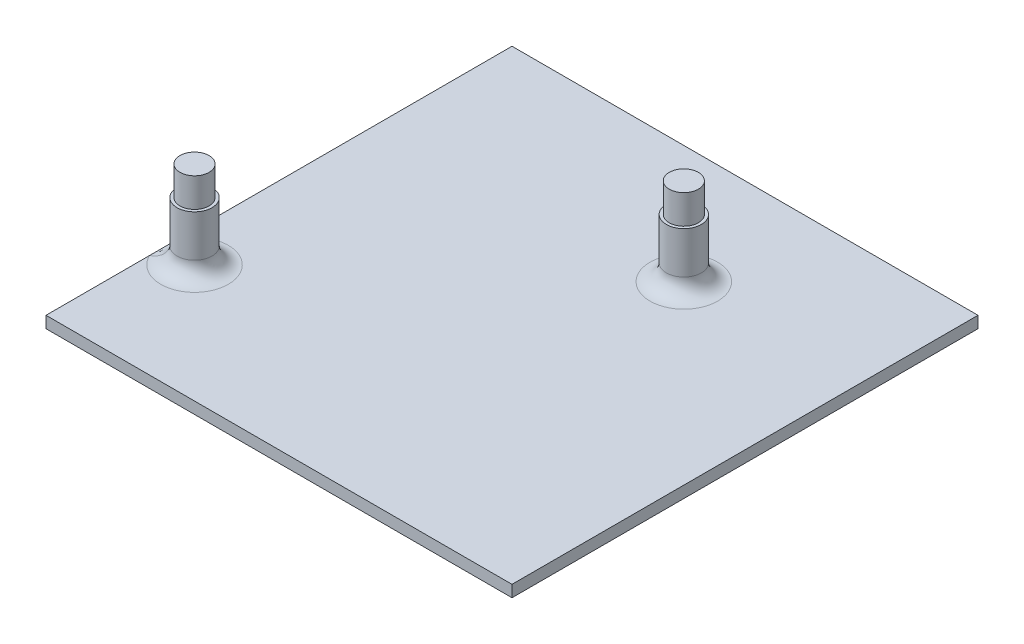
ISO-10303-21;
HEADER;
FILE_DESCRIPTION(('STEP AP214'),'2;1');
FILE_NAME('part.step','',(''),(''),'','','');
FILE_SCHEMA(('AUTOMOTIVE_DESIGN { 1 0 10303 214 1 1 1 1 }'));
ENDSEC;
DATA;
#1=APPLICATION_CONTEXT('core data for automotive mechanical design processes');
#2=APPLICATION_PROTOCOL_DEFINITION('international standard','automotive_design',2000,#1);
#3=PRODUCT_CONTEXT('',#1,'mechanical');
#4=PRODUCT('Part','Part','',(#3));
#5=PRODUCT_RELATED_PRODUCT_CATEGORY('part','',(#4));
#6=PRODUCT_DEFINITION_FORMATION('','',#4);
#7=PRODUCT_DEFINITION_CONTEXT('part definition',#1,'design');
#8=PRODUCT_DEFINITION('design','',#6,#7);
#9=PRODUCT_DEFINITION_SHAPE('','',#8);
#10=(LENGTH_UNIT() NAMED_UNIT(*) SI_UNIT(.MILLI.,.METRE.));
#11=(NAMED_UNIT(*) PLANE_ANGLE_UNIT() SI_UNIT($,.RADIAN.));
#12=(NAMED_UNIT(*) SI_UNIT($,.STERADIAN.) SOLID_ANGLE_UNIT());
#13=UNCERTAINTY_MEASURE_WITH_UNIT(LENGTH_MEASURE(1.E-05),#10,'distance_accuracy_value','');
#14=(GEOMETRIC_REPRESENTATION_CONTEXT(3) GLOBAL_UNCERTAINTY_ASSIGNED_CONTEXT((#13)) GLOBAL_UNIT_ASSIGNED_CONTEXT((#10,
#11,#12)) REPRESENTATION_CONTEXT('',''));
#15=CARTESIAN_POINT('',(0.,0.,0.));
#16=DIRECTION('',(0.,0.,1.));
#17=DIRECTION('',(1.,0.,0.));
#18=AXIS2_PLACEMENT_3D('',#15,#16,#17);
#19=CARTESIAN_POINT('',(22.25,12.,-19.75));
#20=DIRECTION('',(0.,1.,0.));
#21=DIRECTION('',(0.,0.,1.));
#22=AXIS2_PLACEMENT_3D('',#19,#20,#21);
#23=PLANE('',#22);
#24=CARTESIAN_POINT('',(22.25,12.,-19.75));
#25=DIRECTION('',(0.,1.,0.));
#26=DIRECTION('',(0.,0.,1.));
#27=AXIS2_PLACEMENT_3D('',#24,#25,#26);
#28=CIRCLE('',#27,2.99999999999999);
#29=CARTESIAN_POINT('',(22.25,12.,-16.75));
#30=VERTEX_POINT('',#29);
#31=EDGE_CURVE('E184',#30,#30,#28,.T.);
#32=ORIENTED_EDGE('',*,*,#31,.T.);
#33=EDGE_LOOP('',(#32));
#34=FACE_BOUND('',#33,.T.);
#35=CARTESIAN_POINT('',(22.25,12.,-19.75));
#36=DIRECTION('',(0.,1.,0.));
#37=DIRECTION('',(0.,0.,1.));
#38=AXIS2_PLACEMENT_3D('',#35,#36,#37);
#39=CIRCLE('',#38,2.5);
#40=CARTESIAN_POINT('',(22.25,12.,-17.25));
#41=VERTEX_POINT('',#40);
#42=EDGE_CURVE('E198',#41,#41,#39,.T.);
#43=ORIENTED_EDGE('',*,*,#42,.F.);
#44=EDGE_LOOP('',(#43));
#45=FACE_BOUND('',#44,.T.);
#46=ADVANCED_FACE('F37',(#34,#45),#23,.T.);
#47=CARTESIAN_POINT('',(-22.25,12.,19.75));
#48=DIRECTION('',(0.,1.,0.));
#49=DIRECTION('',(0.,0.,1.));
#50=AXIS2_PLACEMENT_3D('',#47,#48,#49);
#51=PLANE('',#50);
#52=CARTESIAN_POINT('',(-22.25,12.,19.75));
#53=DIRECTION('',(0.,1.,0.));
#54=DIRECTION('',(0.,0.,1.));
#55=AXIS2_PLACEMENT_3D('',#52,#53,#54);
#56=CIRCLE('',#55,2.99999999999999);
#57=CARTESIAN_POINT('',(-22.25,12.,22.75));
#58=VERTEX_POINT('',#57);
#59=EDGE_CURVE('E134',#58,#58,#56,.T.);
#60=ORIENTED_EDGE('',*,*,#59,.T.);
#61=EDGE_LOOP('',(#60));
#62=FACE_BOUND('',#61,.T.);
#63=CARTESIAN_POINT('',(-22.25,12.,19.75));
#64=DIRECTION('',(0.,1.,0.));
#65=DIRECTION('',(0.,0.,1.));
#66=AXIS2_PLACEMENT_3D('',#63,#64,#65);
#67=CIRCLE('',#66,2.5);
#68=CARTESIAN_POINT('',(-22.25,12.,22.25));
#69=VERTEX_POINT('',#68);
#70=EDGE_CURVE('E190',#69,#69,#67,.T.);
#71=ORIENTED_EDGE('',*,*,#70,.F.);
#72=EDGE_LOOP('',(#71));
#73=FACE_BOUND('',#72,.T.);
#74=ADVANCED_FACE('F203',(#62,#73),#51,.T.);
#75=CARTESIAN_POINT('',(0.,2.,0.));
#76=DIRECTION('',(0.,1.,0.));
#77=DIRECTION('',(0.,0.,1.));
#78=AXIS2_PLACEMENT_3D('',#75,#76,#77);
#79=PLANE('',#78);
#80=CARTESIAN_POINT('',(22.25,2.,-19.75));
#81=DIRECTION('',(0.,1.,0.));
#82=DIRECTION('',(0.,0.,1.));
#83=AXIS2_PLACEMENT_3D('',#80,#81,#82);
#84=CIRCLE('',#83,5.79999999999999);
#85=CARTESIAN_POINT('',(22.25,2.,-13.95));
#86=VERTEX_POINT('',#85);
#87=EDGE_CURVE('E149',#86,#86,#84,.F.);
#88=ORIENTED_EDGE('',*,*,#87,.T.);
#89=EDGE_LOOP('',(#88));
#90=FACE_BOUND('',#89,.T.);
#91=DIRECTION('',(0.,0.,-1.));
#92=VECTOR('',#91,1.);
#93=CARTESIAN_POINT('',(-27.5,2.,0.));
#94=LINE('',#93,#92);
#95=CARTESIAN_POINT('',(-27.5,2.,17.2847413928759));
#96=VERTEX_POINT('',#95);
#97=CARTESIAN_POINT('',(-27.5,2.,-40.));
#98=VERTEX_POINT('',#97);
#99=EDGE_CURVE('E122',#96,#98,#94,.T.);
#100=ORIENTED_EDGE('',*,*,#99,.F.);
#101=CARTESIAN_POINT('',(-22.25,2.,19.75));
#102=DIRECTION('',(0.,1.,0.));
#103=DIRECTION('',(0.,0.,1.));
#104=AXIS2_PLACEMENT_3D('',#101,#102,#103);
#105=CIRCLE('',#104,5.79999999999999);
#106=CARTESIAN_POINT('',(-27.5,2.,22.2152586071241));
#107=VERTEX_POINT('',#106);
#108=EDGE_CURVE('E147',#96,#107,#105,.F.);
#109=ORIENTED_EDGE('',*,*,#108,.T.);
#110=CARTESIAN_POINT('',(-27.5,2.,40.));
#111=VERTEX_POINT('',#110);
#112=EDGE_CURVE('E126',#111,#107,#94,.T.);
#113=ORIENTED_EDGE('',*,*,#112,.F.);
#114=DIRECTION('',(1.,0.,0.));
#115=VECTOR('',#114,1.);
#116=CARTESIAN_POINT('',(0.,2.,40.));
#117=LINE('',#116,#115);
#118=CARTESIAN_POINT('',(52.5,2.,40.));
#119=VERTEX_POINT('',#118);
#120=EDGE_CURVE('E116',#111,#119,#117,.T.);
#121=ORIENTED_EDGE('',*,*,#120,.T.);
#122=DIRECTION('',(0.,0.,1.));
#123=VECTOR('',#122,1.);
#124=CARTESIAN_POINT('',(52.5,2.,0.));
#125=LINE('',#124,#123);
#126=CARTESIAN_POINT('',(52.5,2.,-40.));
#127=VERTEX_POINT('',#126);
#128=EDGE_CURVE('E99',#127,#119,#125,.T.);
#129=ORIENTED_EDGE('',*,*,#128,.F.);
#130=DIRECTION('',(1.,0.,0.));
#131=VECTOR('',#130,1.);
#132=CARTESIAN_POINT('',(0.,2.,-40.));
#133=LINE('',#132,#131);
#134=EDGE_CURVE('E113',#98,#127,#133,.T.);
#135=ORIENTED_EDGE('',*,*,#134,.F.);
#136=EDGE_LOOP('',(#100,#109,#113,#121,#129,#135));
#137=FACE_BOUND('',#136,.T.);
#138=ADVANCED_FACE('F112',(#90,#137),#79,.T.);
#139=CARTESIAN_POINT('',(52.5,2.,0.));
#140=DIRECTION('',(1.,0.,0.));
#141=DIRECTION('',(0.,0.,-1.));
#142=AXIS2_PLACEMENT_3D('',#139,#140,#141);
#143=PLANE('',#142);
#144=DIRECTION('',(0.,0.,1.));
#145=VECTOR('',#144,1.);
#146=CARTESIAN_POINT('',(52.5,0.,0.));
#147=LINE('',#146,#145);
#148=CARTESIAN_POINT('',(52.5,0.,-40.));
#149=VERTEX_POINT('',#148);
#150=CARTESIAN_POINT('',(52.5,0.,40.));
#151=VERTEX_POINT('',#150);
#152=EDGE_CURVE('E101',#149,#151,#147,.T.);
#153=ORIENTED_EDGE('',*,*,#152,.F.);
#154=DIRECTION('',(0.,-1.,0.));
#155=VECTOR('',#154,1.);
#156=CARTESIAN_POINT('',(52.5,2.,-40.));
#157=LINE('',#156,#155);
#158=EDGE_CURVE('E96',#127,#149,#157,.T.);
#159=ORIENTED_EDGE('',*,*,#158,.F.);
#160=ORIENTED_EDGE('',*,*,#128,.T.);
#161=DIRECTION('',(0.,-1.,0.));
#162=VECTOR('',#161,1.);
#163=CARTESIAN_POINT('',(52.5,2.,40.));
#164=LINE('',#163,#162);
#165=EDGE_CURVE('E131',#119,#151,#164,.T.);
#166=ORIENTED_EDGE('',*,*,#165,.T.);
#167=EDGE_LOOP('',(#153,#159,#160,#166));
#168=FACE_BOUND('',#167,.T.);
#169=ADVANCED_FACE('F98',(#168),#143,.T.);
#170=CARTESIAN_POINT('',(0.,2.,-40.));
#171=DIRECTION('',(0.,0.,-1.));
#172=DIRECTION('',(-1.,0.,0.));
#173=AXIS2_PLACEMENT_3D('',#170,#171,#172);
#174=PLANE('',#173);
#175=DIRECTION('',(1.,0.,0.));
#176=VECTOR('',#175,1.);
#177=CARTESIAN_POINT('',(0.,0.,-40.));
#178=LINE('',#177,#176);
#179=CARTESIAN_POINT('',(-27.5,0.,-40.));
#180=VERTEX_POINT('',#179);
#181=EDGE_CURVE('E133',#180,#149,#178,.T.);
#182=ORIENTED_EDGE('',*,*,#181,.F.);
#183=DIRECTION('',(0.,-1.,0.));
#184=VECTOR('',#183,1.);
#185=CARTESIAN_POINT('',(-27.5,2.,-40.));
#186=LINE('',#185,#184);
#187=EDGE_CURVE('E107',#98,#180,#186,.T.);
#188=ORIENTED_EDGE('',*,*,#187,.F.);
#189=ORIENTED_EDGE('',*,*,#134,.T.);
#190=ORIENTED_EDGE('',*,*,#158,.T.);
#191=EDGE_LOOP('',(#182,#188,#189,#190));
#192=FACE_BOUND('',#191,.T.);
#193=ADVANCED_FACE('F121',(#192),#174,.T.);
#194=CARTESIAN_POINT('',(-27.5,2.,0.));
#195=DIRECTION('',(-1.,0.,0.));
#196=DIRECTION('',(0.,0.,1.));
#197=AXIS2_PLACEMENT_3D('',#194,#195,#196);
#198=PLANE('',#197);
#199=DIRECTION('',(0.,0.,-1.));
#200=VECTOR('',#199,1.);
#201=CARTESIAN_POINT('',(-27.5,0.,0.));
#202=LINE('',#201,#200);
#203=CARTESIAN_POINT('',(-27.5,0.,40.));
#204=VERTEX_POINT('',#203);
#205=EDGE_CURVE('E136',#204,#180,#202,.T.);
#206=ORIENTED_EDGE('',*,*,#205,.F.);
#207=DIRECTION('',(0.,-1.,0.));
#208=VECTOR('',#207,1.);
#209=CARTESIAN_POINT('',(-27.5,2.,40.));
#210=LINE('',#209,#208);
#211=EDGE_CURVE('E142',#111,#204,#210,.T.);
#212=ORIENTED_EDGE('',*,*,#211,.F.);
#213=ORIENTED_EDGE('',*,*,#112,.T.);
#214=EDGE_CURVE('E124',#107,#96,#94,.T.);
#215=ORIENTED_EDGE('',*,*,#214,.T.);
#216=ORIENTED_EDGE('',*,*,#99,.T.);
#217=ORIENTED_EDGE('',*,*,#187,.T.);
#218=EDGE_LOOP('',(#206,#212,#213,#215,#216,#217));
#219=FACE_BOUND('',#218,.T.);
#220=ADVANCED_FACE('F179',(#219),#198,.T.);
#221=CARTESIAN_POINT('',(0.,2.,40.));
#222=DIRECTION('',(0.,0.,-1.));
#223=DIRECTION('',(-1.,0.,0.));
#224=AXIS2_PLACEMENT_3D('',#221,#222,#223);
#225=PLANE('',#224);
#226=DIRECTION('',(1.,0.,0.));
#227=VECTOR('',#226,1.);
#228=CARTESIAN_POINT('',(0.,0.,40.));
#229=LINE('',#228,#227);
#230=EDGE_CURVE('E118',#204,#151,#229,.T.);
#231=ORIENTED_EDGE('',*,*,#230,.T.);
#232=ORIENTED_EDGE('',*,*,#165,.F.);
#233=ORIENTED_EDGE('',*,*,#120,.F.);
#234=ORIENTED_EDGE('',*,*,#211,.T.);
#235=EDGE_LOOP('',(#231,#232,#233,#234));
#236=FACE_BOUND('',#235,.T.);
#237=ADVANCED_FACE('F215',(#236),#225,.F.);
#238=CARTESIAN_POINT('',(0.,0.,0.));
#239=DIRECTION('',(0.,1.,0.));
#240=DIRECTION('',(0.,0.,1.));
#241=AXIS2_PLACEMENT_3D('',#238,#239,#240);
#242=PLANE('',#241);
#243=ORIENTED_EDGE('',*,*,#152,.T.);
#244=ORIENTED_EDGE('',*,*,#230,.F.);
#245=ORIENTED_EDGE('',*,*,#205,.T.);
#246=ORIENTED_EDGE('',*,*,#181,.T.);
#247=EDGE_LOOP('',(#243,#244,#245,#246));
#248=FACE_BOUND('',#247,.T.);
#249=ADVANCED_FACE('F208',(#248),#242,.F.);
#250=CARTESIAN_POINT('',(-22.25,12.,19.75));
#251=DIRECTION('',(0.,-1.,0.));
#252=DIRECTION('',(0.,0.,-1.));
#253=AXIS2_PLACEMENT_3D('',#250,#251,#252);
#254=CYLINDRICAL_SURFACE('',#253,2.99999999999999);
#255=CARTESIAN_POINT('',(-22.25,4.8,19.75));
#256=DIRECTION('',(0.,1.,0.));
#257=DIRECTION('',(0.,0.,1.));
#258=AXIS2_PLACEMENT_3D('',#255,#256,#257);
#259=CIRCLE('',#258,2.99999999999999);
#260=CARTESIAN_POINT('',(-24.9655172413793,4.8,21.0251337623056));
#261=VERTEX_POINT('',#260);
#262=CARTESIAN_POINT('',(-24.9655172413793,4.8,18.4748662376944));
#263=VERTEX_POINT('',#262);
#264=EDGE_CURVE('E50',#261,#263,#259,.T.);
#265=ORIENTED_EDGE('',*,*,#264,.T.);
#266=CARTESIAN_POINT('',(-24.7692528942936,4.77417049656208,18.1210847613846));
#267=CARTESIAN_POINT('',(-24.8954852423719,1.64376070176841,18.3163135865014));
#268=CARTESIAN_POINT('',(-27.5,2.,16.6007638720103));
#269=CARTESIAN_POINT('',(-24.8110918119802,4.78517692842336,18.185767646076));
#270=CARTESIAN_POINT('',(-24.8972590270731,1.72067115016347,18.3295160766704));
#271=CARTESIAN_POINT('',(-27.5,2.,16.725817449076));
#272=CARTESIAN_POINT('',(-24.850472839914,4.79204629072668,18.252161558553));
#273=CARTESIAN_POINT('',(-24.9076179563057,1.79329308559051,18.353310456867));
#274=CARTESIAN_POINT('',(-27.5,2.,16.8541790131978));
#275=CARTESIAN_POINT('',(-24.9240101398747,4.79976853239917,18.3877983466798));
#276=CARTESIAN_POINT('',(-24.9387131702983,1.92626409147773,18.4190561636837));
#277=CARTESIAN_POINT('',(-27.5,2.,17.1164101369115));
#278=CARTESIAN_POINT('',(-24.958171394117,4.80062718445945,18.4570384245507));
#279=CARTESIAN_POINT('',(-24.9592390350264,1.98702493845238,18.4606502081707));
#280=CARTESIAN_POINT('',(-27.5,2.,17.250274287464));
#281=CARTESIAN_POINT('',(-25.0210265718221,4.7985986028877,18.5978870073453));
#282=CARTESIAN_POINT('',(-25.0042832348371,2.09565548832035,18.559171195585));
#283=CARTESIAN_POINT('',(-27.5,2.,17.522581547535));
#284=CARTESIAN_POINT('',(-25.0497230997607,4.79571315883266,18.669494364835));
#285=CARTESIAN_POINT('',(-25.0287811240282,2.1439214416585,18.6159228247551));
#286=CARTESIAN_POINT('',(-27.5,2.,17.6610224386807));
#287=CARTESIAN_POINT('',(-25.101517477056,4.78808057493382,18.8146981189408));
#288=CARTESIAN_POINT('',(-25.0772207182193,2.22849678613192,18.7415277936623));
#289=CARTESIAN_POINT('',(-27.5,2.,17.9417496966184));
#290=CARTESIAN_POINT('',(-25.1246138929492,4.78333295924137,18.8882950194743));
#291=CARTESIAN_POINT('',(-25.1012448452894,2.26512399463445,18.8103804447597));
#292=CARTESIAN_POINT('',(-27.5,2.,18.0840370376502));
#293=CARTESIAN_POINT('',(-25.1655895314774,4.77344839757793,19.0389531785771));
#294=CARTESIAN_POINT('',(-25.1460559294076,2.32834314771791,18.9590241895285));
#295=CARTESIAN_POINT('',(-27.5,2.,18.3753094785825));
#296=CARTESIAN_POINT('',(-25.1833197156384,4.76830458835179,19.116054875812));
#297=CARTESIAN_POINT('',(-25.1668811404398,2.35492044597049,19.0392141681105));
#298=CARTESIAN_POINT('',(-27.5,2.,18.5243727599032));
#299=CARTESIAN_POINT('',(-25.2126381723922,4.75908767556742,19.2714341882516));
#300=CARTESIAN_POINT('',(-25.2022205209154,2.39791976692792,19.2060401722496));
#301=CARTESIAN_POINT('',(-27.5,2.,18.8247727639529));
#302=CARTESIAN_POINT('',(-25.2242265270297,4.75501455770689,19.3497117877337));
#303=CARTESIAN_POINT('',(-25.2168587071532,2.41451548263067,19.29292805439));
#304=CARTESIAN_POINT('',(-27.5,2.,18.9761094562852));
#305=CARTESIAN_POINT('',(-25.2411816618021,4.74886206719833,19.5069336120456));
#306=CARTESIAN_POINT('',(-25.2384544756664,2.43848419453875,19.4701745419312));
#307=CARTESIAN_POINT('',(-27.5,2.,19.2800716499548));
#308=CARTESIAN_POINT('',(-25.2465505700511,4.74678201262405,19.5858775995377));
#309=CARTESIAN_POINT('',(-25.2454974468607,2.44595592350541,19.5608566125283));
#310=CARTESIAN_POINT('',(-27.5,2.,19.4326966924396));
#311=CARTESIAN_POINT('',(-25.2510357833348,4.74505231404402,19.743952092535));
#312=CARTESIAN_POINT('',(-25.2513477811699,2.45218261121962,19.7428695359571));
#313=CARTESIAN_POINT('',(-27.5,2.,19.738307378901));
#314=CARTESIAN_POINT('',(-25.2501518889402,4.74540274755724,19.8230826039088));
#315=CARTESIAN_POINT('',(-25.2501781075379,2.45096194310976,19.8345591480407));
#316=CARTESIAN_POINT('',(-27.5,2.,19.8912930342236));
#317=CARTESIAN_POINT('',(-25.2419097670635,4.74855114933611,19.9854900925861));
#318=CARTESIAN_POINT('',(-25.2394661562374,2.43948446257397,20.020935905976));
#319=CARTESIAN_POINT('',(-27.5,2.,20.2052808456665));
#320=CARTESIAN_POINT('',(-25.2341876719489,4.7514866206219,20.0687480702024));
#321=CARTESIAN_POINT('',(-25.2294064532954,2.42866925559245,20.1158900982203));
#322=CARTESIAN_POINT('',(-27.5,2.,20.3662462690581));
#323=CARTESIAN_POINT('',(-25.2118276987181,4.75929567146594,20.234309344898));
#324=CARTESIAN_POINT('',(-25.201345871515,2.39672316592056,20.3000950359052));
#325=CARTESIAN_POINT('',(-27.5,2.,20.6863314001361));
#326=CARTESIAN_POINT('',(-25.1971892463749,4.76416941194268,20.3166125621273));
#327=CARTESIAN_POINT('',(-25.1832268220365,2.37544855793896,20.3897045494446));
#328=CARTESIAN_POINT('',(-27.5,2.,20.845450953446));
#329=CARTESIAN_POINT('',(-25.161103533737,4.77457322202537,20.47969207122));
#330=CARTESIAN_POINT('',(-25.141122331435,2.32152161571593,20.5598843313358));
#331=CARTESIAN_POINT('',(-27.5,2.,21.1607380043588));
#332=CARTESIAN_POINT('',(-25.1396568298362,4.7801032379751,20.5604684872876));
#333=CARTESIAN_POINT('',(-25.1169818334237,2.28862637223174,20.6407057313229));
#334=CARTESIAN_POINT('',(-27.5,2.,21.3169057420896));
#335=CARTESIAN_POINT('',(-25.0900948968472,4.79003775233187,20.719965490956));
#336=CARTESIAN_POINT('',(-25.0660777594657,2.21014529847881,20.7898771822572));
#337=CARTESIAN_POINT('',(-27.5,2.,21.6252666158484));
#338=CARTESIAN_POINT('',(-25.0619803871397,4.79444237205001,20.7986862993174));
#339=CARTESIAN_POINT('',(-25.0391738093877,2.16420640113049,20.8583200189413));
#340=CARTESIAN_POINT('',(-27.5,2.,21.7774601786799));
#341=CARTESIAN_POINT('',(-25.0046578876957,4.79942741935019,20.9402295163838));
#342=CARTESIAN_POINT('',(-24.9920330498828,2.06777707786534,20.9686045214795));
#343=CARTESIAN_POINT('',(-27.5,2.,22.0511103983424));
#344=CARTESIAN_POINT('',(-24.9764671763034,4.80053475633949,21.0034602088649));
#345=CARTESIAN_POINT('',(-24.9713501667145,2.01900312146797,21.0130801128218));
#346=CARTESIAN_POINT('',(-27.5,2.,22.1733564038066));
#347=CARTESIAN_POINT('',(-24.9157991347862,4.79896363535338,21.1277874097319));
#348=CARTESIAN_POINT('',(-24.9351640174477,1.91180905272332,21.0889856028493));
#349=CARTESIAN_POINT('',(-27.5,2.,22.4137223254806));
#350=CARTESIAN_POINT('',(-24.8833239809261,4.79628709272234,21.1888849818343));
#351=CARTESIAN_POINT('',(-24.9197218564199,1.85310104467818,21.1202464060257));
#352=CARTESIAN_POINT('',(-27.5,2.,22.5318442982087));
#353=CARTESIAN_POINT('',(-24.8142134403087,4.78548799501285,21.3087148471261));
#354=CARTESIAN_POINT('',(-24.8987281718112,1.72651431990266,21.1678216577369));
#355=CARTESIAN_POINT('',(-27.5,2.,22.7635153711148));
#356=CARTESIAN_POINT('',(-24.7775706571264,4.77735562800164,21.3674426764004));
#357=CARTESIAN_POINT('',(-24.8933952490675,1.65833151353528,21.1838167695508));
#358=CARTESIAN_POINT('',(-27.5,2.,22.877055841057));
#359=CARTESIAN_POINT('',(-24.7004720897557,4.75373849685538,21.4820484057565));
#360=CARTESIAN_POINT('',(-24.8983284917734,1.51534107440832,21.1997472047897));
#361=CARTESIAN_POINT('',(-27.5,2.,23.098626917822));
#362=CARTESIAN_POINT('',(-24.6600104266803,4.73824224358762,21.5379217008061));
#363=CARTESIAN_POINT('',(-24.9089901150295,1.4403216544844,21.1992819280106));
#364=CARTESIAN_POINT('',(-27.5,2.,23.2066486215823));
#365=CARTESIAN_POINT('',(-24.6178474110053,4.71812411170249,21.5920908333183));
#366=CARTESIAN_POINT('',(-24.9305172770385,1.36459567981096,21.1901809386512));
#367=CARTESIAN_POINT('',(-27.5,2.,23.3113756110821));
#368=(BOUNDED_SURFACE() B_SPLINE_SURFACE(3,2,((#266,#267,#268),(#269,#270,#271),(#272,#273,
#274),(#275,#276,#277),(#278,#279,#280),(#281,#282,#283),(#284,#285,#286),(#287,#288,#289),
(#290,#291,#292),(#293,#294,#295),(#296,#297,#298),(#299,#300,#301),(#302,#303,#304),(#305,#306,
#307),(#308,#309,#310),(#311,#312,#313),(#314,#315,#316),(#317,#318,#319),(#320,#321,#322),
(#323,#324,#325),(#326,#327,#328),(#329,#330,#331),(#332,#333,#334),(#335,#336,#337),(#338,#339,
#340),(#341,#342,#343),(#344,#345,#346),(#347,#348,#349),(#350,#351,#352),(#353,#354,#355),
(#356,#357,#358),(#359,#360,#361),(#362,#363,#364),(#365,#366,#367)),.UNSPECIFIED.,.F.,.F.,
.F.) B_SPLINE_SURFACE_WITH_KNOTS((4,2,2,2,2,2,2,2,2,2,2,2,2,2,2,2,4),(3,3),(0.,
0.447699936927959,0.894969843401298,1.34202604564867,1.78919656057607,2.24783852294819,
2.70647435846911,3.16495321572425,3.62344669595603,4.10790903247478,4.59241159830107,
5.07687457909074,5.56128531556369,5.96249176829797,6.36349520890832,6.76522176739417,
7.16757716771426),(0.,1.),
.UNSPECIFIED.) GEOMETRIC_REPRESENTATION_ITEM() RATIONAL_B_SPLINE_SURFACE(((1.,0.665657729961146,
1.),(1.,0.674068192248949,1.),(1.,0.682261572337793,1.),(1.,0.697947007885751,1.),(1.,
0.705439729430743,1.),(1.,0.719470488128708,1.),(1.,0.726008979716519,1.),(1.,0.737961337738242,
1.),(1.,0.743374916176966,1.),(1.,0.753062881688334,1.),(1.,0.75730448195919,1.),(1.,
0.764356441895352,1.),(1.,0.767166820679387,1.),(1.,0.771288600852572,1.),(1.,0.772600514970675,
1.),(1.,0.773696096727978,1.),(1.,0.773479715623109,1.),(1.,0.771467977598784,1.),(1.,
0.769583882386171,1.),(1.,0.7641640480684,1.),(1.,0.760628171825242,1.),(1.,0.752000048847341,
1.),(1.,0.74690792929545,1.),(1.,0.735309004362114,1.),(1.,0.728802351599106,1.),(1.,
0.715796759392189,1.),(1.,0.70948845982624,1.),(1.,0.696193884665162,1.),(1.,0.689207953743885,
1.),(1.,0.674734333407205,1.),(1.,0.667245761902015,1.),(1.,0.652032309829969,1.),(1.,
0.644307077706566,1.),(1.,0.636602950799728,1.))) REPRESENTATION_ITEM('') SURFACE());
#369=CARTESIAN_POINT('',(-24.7692528942936,4.77417049656208,18.1210847613846));
#370=CARTESIAN_POINT('',(-24.8110918119802,4.78517692842336,18.185767646076));
#371=CARTESIAN_POINT('',(-24.850472839914,4.79204629072668,18.252161558553));
#372=CARTESIAN_POINT('',(-24.9240101398747,4.79976853239917,18.3877983466798));
#373=CARTESIAN_POINT('',(-24.958171394117,4.80062718445945,18.4570384245507));
#374=CARTESIAN_POINT('',(-25.0210265718221,4.7985986028877,18.5978870073453));
#375=CARTESIAN_POINT('',(-25.0497230997607,4.79571315883266,18.669494364835));
#376=CARTESIAN_POINT('',(-25.101517477056,4.78808057493382,18.8146981189408));
#377=CARTESIAN_POINT('',(-25.1246138929492,4.78333295924137,18.8882950194743));
#378=CARTESIAN_POINT('',(-25.1655895314774,4.77344839757793,19.0389531785771));
#379=CARTESIAN_POINT('',(-25.1833197156384,4.76830458835179,19.116054875812));
#380=CARTESIAN_POINT('',(-25.2126381723922,4.75908767556742,19.2714341882516));
#381=CARTESIAN_POINT('',(-25.2242265270297,4.75501455770689,19.3497117877337));
#382=CARTESIAN_POINT('',(-25.2411816618021,4.74886206719833,19.5069336120456));
#383=CARTESIAN_POINT('',(-25.2465505700511,4.74678201262405,19.5858775995377));
#384=CARTESIAN_POINT('',(-25.2510357833348,4.74505231404402,19.743952092535));
#385=CARTESIAN_POINT('',(-25.2501518889402,4.74540274755724,19.8230826039088));
#386=CARTESIAN_POINT('',(-25.2419097670635,4.74855114933611,19.9854900925861));
#387=CARTESIAN_POINT('',(-25.2341876719489,4.7514866206219,20.0687480702024));
#388=CARTESIAN_POINT('',(-25.2118276987181,4.75929567146594,20.234309344898));
#389=CARTESIAN_POINT('',(-25.1971892463749,4.76416941194268,20.3166125621273));
#390=CARTESIAN_POINT('',(-25.161103533737,4.77457322202537,20.47969207122));
#391=CARTESIAN_POINT('',(-25.1396568298362,4.7801032379751,20.5604684872876));
#392=CARTESIAN_POINT('',(-25.0900948968472,4.79003775233187,20.719965490956));
#393=CARTESIAN_POINT('',(-25.0619803871397,4.79444237205001,20.7986862993174));
#394=CARTESIAN_POINT('',(-25.0046578876957,4.79942741935019,20.9402295163838));
#395=CARTESIAN_POINT('',(-24.9764671763034,4.80053475633949,21.0034602088649));
#396=CARTESIAN_POINT('',(-24.9157991347862,4.79896363535338,21.1277874097319));
#397=CARTESIAN_POINT('',(-24.8833239809261,4.79628709272234,21.1888849818343));
#398=CARTESIAN_POINT('',(-24.8142134403087,4.78548799501285,21.3087148471261));
#399=CARTESIAN_POINT('',(-24.7775706571264,4.77735562800164,21.3674426764004));
#400=CARTESIAN_POINT('',(-24.7004720897557,4.75373849685538,21.4820484057565));
#401=CARTESIAN_POINT('',(-24.6600104266803,4.73824224358762,21.5379217008061));
#402=CARTESIAN_POINT('',(-24.6178474110053,4.71812411170249,21.5920908333183));
#403=B_SPLINE_CURVE_WITH_KNOTS('',3,(#369,#370,#371,#372,#373,#374,#375,#376,#377,#378,#379,
#380,#381,#382,#383,#384,#385,#386,#387,#388,#389,#390,#391,#392,#393,#394,#395,#396,#397,#398,
#399,#400,#401,#402),.UNSPECIFIED.,.F.,.F.,(4,2,2,2,2,2,2,2,2,2,2,2,2,2,2,2,4),(0.,
0.447699936927959,0.894969843401298,1.34202604564867,1.78919656057607,2.24783852294819,
2.70647435846911,3.16495321572425,3.62344669595603,4.10790903247478,4.59241159830107,
5.07687457909074,5.56128531556369,5.96249176829797,6.36349520890832,6.76522176739417,
7.16757716771426),.UNSPECIFIED.);
#404=EDGE_CURVE('E11',#263,#261,#403,.T.);
#405=ORIENTED_EDGE('',*,*,#404,.T.);
#406=EDGE_LOOP('',(#265,#405));
#407=FACE_BOUND('',#406,.T.);
#408=ORIENTED_EDGE('',*,*,#59,.F.);
#409=EDGE_LOOP('',(#408));
#410=FACE_BOUND('',#409,.T.);
#411=ADVANCED_FACE('F159',(#407,#410),#254,.T.);
#412=CARTESIAN_POINT('',(22.25,12.,-19.75));
#413=DIRECTION('',(0.,-1.,0.));
#414=DIRECTION('',(0.,0.,-1.));
#415=AXIS2_PLACEMENT_3D('',#412,#413,#414);
#416=CYLINDRICAL_SURFACE('',#415,2.99999999999999);
#417=CARTESIAN_POINT('',(22.25,4.8,-19.75));
#418=DIRECTION('',(0.,1.,0.));
#419=DIRECTION('',(0.,0.,1.));
#420=AXIS2_PLACEMENT_3D('',#417,#418,#419);
#421=CIRCLE('',#420,2.99999999999999);
#422=CARTESIAN_POINT('',(22.25,4.8,-16.75));
#423=VERTEX_POINT('',#422);
#424=EDGE_CURVE('E106',#423,#423,#421,.T.);
#425=ORIENTED_EDGE('',*,*,#424,.T.);
#426=EDGE_LOOP('',(#425));
#427=FACE_BOUND('',#426,.T.);
#428=ORIENTED_EDGE('',*,*,#31,.F.);
#429=EDGE_LOOP('',(#428));
#430=FACE_BOUND('',#429,.T.);
#431=ADVANCED_FACE('F207',(#427,#430),#416,.T.);
#432=CARTESIAN_POINT('',(22.25,4.8,-19.75));
#433=DIRECTION('',(0.,1.,0.));
#434=DIRECTION('',(0.,0.,1.));
#435=AXIS2_PLACEMENT_3D('',#432,#433,#434);
#436=TOROIDAL_SURFACE('',#435,5.79999999999999,2.8);
#437=ORIENTED_EDGE('',*,*,#87,.F.);
#438=EDGE_LOOP('',(#437));
#439=FACE_BOUND('',#438,.T.);
#440=ORIENTED_EDGE('',*,*,#424,.F.);
#441=EDGE_LOOP('',(#440));
#442=FACE_BOUND('',#441,.T.);
#443=ADVANCED_FACE('F168',(#439,#442),#436,.F.);
#444=CARTESIAN_POINT('',(-22.25,4.8,19.75));
#445=DIRECTION('',(0.,1.,0.));
#446=DIRECTION('',(0.,0.,1.));
#447=AXIS2_PLACEMENT_3D('',#444,#445,#446);
#448=TOROIDAL_SURFACE('',#447,5.79999999999999,2.8);
#449=CARTESIAN_POINT('',(-27.5,4.8,22.2152586071241));
#450=DIRECTION('',(0.425044587435197,0.,0.905172413793109));
#451=DIRECTION('',(0.905172413793109,0.,-0.425044587435197));
#452=AXIS2_PLACEMENT_3D('',#449,#450,#451);
#453=CIRCLE('',#452,2.8);
#454=EDGE_CURVE('E63',#107,#261,#453,.T.);
#455=ORIENTED_EDGE('',*,*,#454,.F.);
#456=ORIENTED_EDGE('',*,*,#108,.F.);
#457=CARTESIAN_POINT('',(-27.5,4.8,17.2847413928759));
#458=DIRECTION('',(0.425044587435198,0.,-0.905172413793109));
#459=DIRECTION('',(-0.905172413793109,0.,-0.425044587435198));
#460=AXIS2_PLACEMENT_3D('',#457,#458,#459);
#461=CIRCLE('',#460,2.8);
#462=EDGE_CURVE('E183',#263,#96,#461,.T.);
#463=ORIENTED_EDGE('',*,*,#462,.F.);
#464=ORIENTED_EDGE('',*,*,#264,.F.);
#465=EDGE_LOOP('',(#455,#456,#463,#464));
#466=FACE_BOUND('',#465,.T.);
#467=ADVANCED_FACE('F39',(#466),#448,.F.);
#468=ORIENTED_EDGE('',*,*,#462,.T.);
#469=ORIENTED_EDGE('',*,*,#214,.F.);
#470=ORIENTED_EDGE('',*,*,#454,.T.);
#471=ORIENTED_EDGE('',*,*,#404,.F.);
#472=EDGE_LOOP('',(#468,#469,#470,#471));
#473=FACE_BOUND('',#472,.T.);
#474=ADVANCED_FACE('F169',(#473),#368,.F.);
#475=CARTESIAN_POINT('',(-22.25,17.,19.75));
#476=DIRECTION('',(0.,-1.,0.));
#477=DIRECTION('',(0.,0.,-1.));
#478=AXIS2_PLACEMENT_3D('',#475,#476,#477);
#479=CYLINDRICAL_SURFACE('',#478,2.5);
#480=CARTESIAN_POINT('',(-22.25,17.,19.75));
#481=DIRECTION('',(0.,1.,0.));
#482=DIRECTION('',(0.,0.,1.));
#483=AXIS2_PLACEMENT_3D('',#480,#481,#482);
#484=CIRCLE('',#483,2.5);
#485=CARTESIAN_POINT('',(-22.25,17.,22.25));
#486=VERTEX_POINT('',#485);
#487=EDGE_CURVE('E188',#486,#486,#484,.T.);
#488=ORIENTED_EDGE('',*,*,#487,.F.);
#489=EDGE_LOOP('',(#488));
#490=FACE_BOUND('',#489,.T.);
#491=ORIENTED_EDGE('',*,*,#70,.T.);
#492=EDGE_LOOP('',(#491));
#493=FACE_BOUND('',#492,.T.);
#494=ADVANCED_FACE('F173',(#490,#493),#479,.T.);
#495=CARTESIAN_POINT('',(-22.25,17.,19.75));
#496=DIRECTION('',(0.,1.,0.));
#497=DIRECTION('',(0.,0.,1.));
#498=AXIS2_PLACEMENT_3D('',#495,#496,#497);
#499=PLANE('',#498);
#500=ORIENTED_EDGE('',*,*,#487,.T.);
#501=EDGE_LOOP('',(#500));
#502=FACE_BOUND('',#501,.T.);
#503=ADVANCED_FACE('F227',(#502),#499,.T.);
#504=CARTESIAN_POINT('',(22.25,17.,-19.75));
#505=DIRECTION('',(0.,-1.,0.));
#506=DIRECTION('',(0.,0.,-1.));
#507=AXIS2_PLACEMENT_3D('',#504,#505,#506);
#508=CYLINDRICAL_SURFACE('',#507,2.5);
#509=CARTESIAN_POINT('',(22.25,17.,-19.75));
#510=DIRECTION('',(0.,1.,0.));
#511=DIRECTION('',(0.,0.,1.));
#512=AXIS2_PLACEMENT_3D('',#509,#510,#511);
#513=CIRCLE('',#512,2.5);
#514=CARTESIAN_POINT('',(22.25,17.,-17.25));
#515=VERTEX_POINT('',#514);
#516=EDGE_CURVE('E195',#515,#515,#513,.T.);
#517=ORIENTED_EDGE('',*,*,#516,.F.);
#518=EDGE_LOOP('',(#517));
#519=FACE_BOUND('',#518,.T.);
#520=ORIENTED_EDGE('',*,*,#42,.T.);
#521=EDGE_LOOP('',(#520));
#522=FACE_BOUND('',#521,.T.);
#523=ADVANCED_FACE('F231',(#519,#522),#508,.T.);
#524=CARTESIAN_POINT('',(22.25,17.,-19.75));
#525=DIRECTION('',(0.,1.,0.));
#526=DIRECTION('',(0.,0.,1.));
#527=AXIS2_PLACEMENT_3D('',#524,#525,#526);
#528=PLANE('',#527);
#529=ORIENTED_EDGE('',*,*,#516,.T.);
#530=EDGE_LOOP('',(#529));
#531=FACE_BOUND('',#530,.T.);
#532=ADVANCED_FACE('F234',(#531),#528,.T.);
#533=CLOSED_SHELL('',(#46,#74,#138,#169,#193,#220,#237,#249,#411,#431,#443,#467,#474,#494,#503,
#523,#532));
#534=MANIFOLD_SOLID_BREP('B2',#533);
#535=ADVANCED_BREP_SHAPE_REPRESENTATION('',(#18,#534),#14);
#536=SHAPE_DEFINITION_REPRESENTATION(#9,#535);
ENDSEC;
END-ISO-10303-21;
